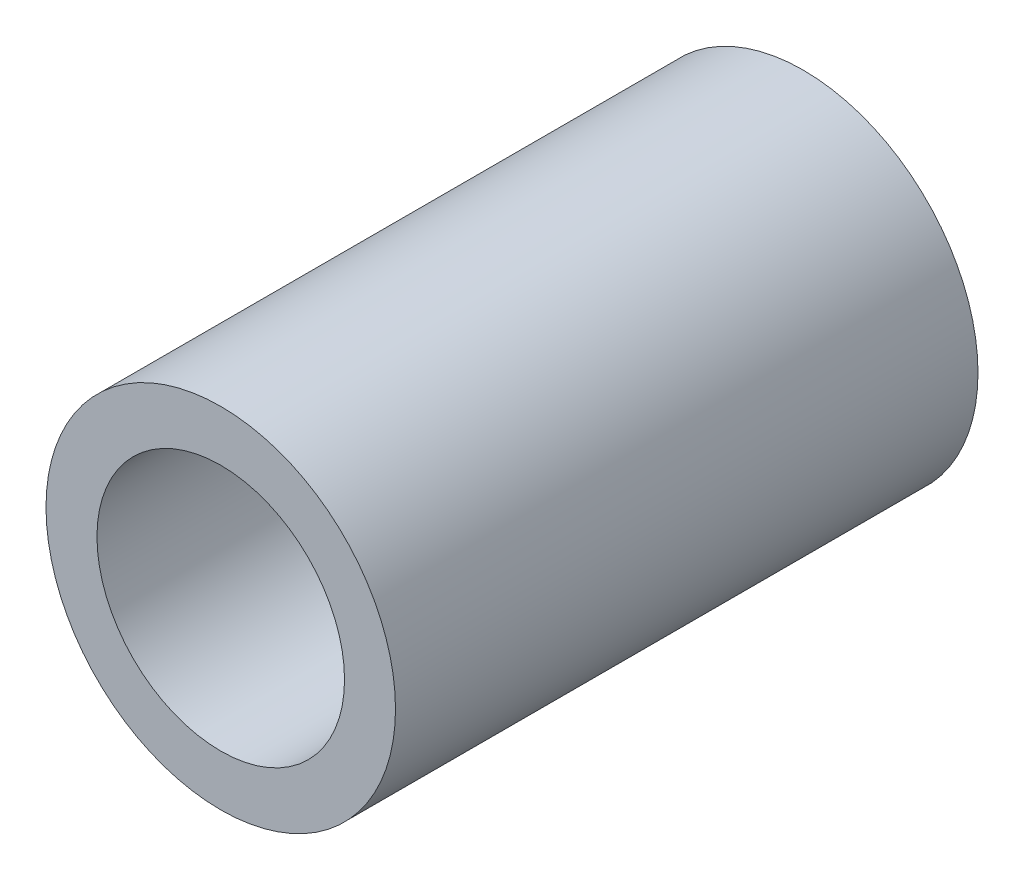
ISO-10303-21;
HEADER;
FILE_DESCRIPTION(('STEP AP214'),'2;1');
FILE_NAME('part.step','',(''),(''),'','','');
FILE_SCHEMA(('AUTOMOTIVE_DESIGN { 1 0 10303 214 1 1 1 1 }'));
ENDSEC;
DATA;
#1=APPLICATION_CONTEXT('core data for automotive mechanical design processes');
#2=APPLICATION_PROTOCOL_DEFINITION('international standard','automotive_design',2000,#1);
#3=PRODUCT_CONTEXT('',#1,'mechanical');
#4=PRODUCT('Part','Part','',(#3));
#5=PRODUCT_RELATED_PRODUCT_CATEGORY('part','',(#4));
#6=PRODUCT_DEFINITION_FORMATION('','',#4);
#7=PRODUCT_DEFINITION_CONTEXT('part definition',#1,'design');
#8=PRODUCT_DEFINITION('design','',#6,#7);
#9=PRODUCT_DEFINITION_SHAPE('','',#8);
#10=(LENGTH_UNIT() NAMED_UNIT(*) SI_UNIT(.MILLI.,.METRE.));
#11=(NAMED_UNIT(*) PLANE_ANGLE_UNIT() SI_UNIT($,.RADIAN.));
#12=(NAMED_UNIT(*) SI_UNIT($,.STERADIAN.) SOLID_ANGLE_UNIT());
#13=UNCERTAINTY_MEASURE_WITH_UNIT(LENGTH_MEASURE(1.E-05),#10,'distance_accuracy_value','');
#14=(GEOMETRIC_REPRESENTATION_CONTEXT(3) GLOBAL_UNCERTAINTY_ASSIGNED_CONTEXT((#13)) GLOBAL_UNIT_ASSIGNED_CONTEXT((#10,
#11,#12)) REPRESENTATION_CONTEXT('',''));
#15=CARTESIAN_POINT('',(0.,0.,0.));
#16=DIRECTION('',(0.,0.,1.));
#17=DIRECTION('',(1.,0.,0.));
#18=AXIS2_PLACEMENT_3D('',#15,#16,#17);
#19=CARTESIAN_POINT('',(33.,0.,20.));
#20=DIRECTION('',(0.,0.,1.));
#21=DIRECTION('',(1.,0.,0.));
#22=AXIS2_PLACEMENT_3D('',#19,#20,#21);
#23=PLANE('',#22);
#24=CARTESIAN_POINT('',(33.,0.,20.));
#25=DIRECTION('',(0.,0.,1.));
#26=DIRECTION('',(1.,0.,0.));
#27=AXIS2_PLACEMENT_3D('',#24,#25,#26);
#28=CIRCLE('',#27,6.);
#29=CARTESIAN_POINT('',(39.,0.,20.));
#30=VERTEX_POINT('',#29);
#31=EDGE_CURVE('E10',#30,#30,#28,.T.);
#32=ORIENTED_EDGE('',*,*,#31,.T.);
#33=EDGE_LOOP('',(#32));
#34=FACE_BOUND('',#33,.T.);
#35=CARTESIAN_POINT('',(33.,0.,20.));
#36=DIRECTION('',(0.,0.,1.));
#37=DIRECTION('',(1.,0.,0.));
#38=AXIS2_PLACEMENT_3D('',#35,#36,#37);
#39=CIRCLE('',#38,4.25000000000001);
#40=CARTESIAN_POINT('',(37.25,0.,20.));
#41=VERTEX_POINT('',#40);
#42=EDGE_CURVE('E39',#41,#41,#39,.T.);
#43=ORIENTED_EDGE('',*,*,#42,.F.);
#44=EDGE_LOOP('',(#43));
#45=FACE_BOUND('',#44,.T.);
#46=ADVANCED_FACE('F28',(#34,#45),#23,.T.);
#47=CARTESIAN_POINT('',(33.,0.,0.));
#48=DIRECTION('',(0.,0.,1.));
#49=DIRECTION('',(1.,0.,0.));
#50=AXIS2_PLACEMENT_3D('',#47,#48,#49);
#51=PLANE('',#50);
#52=CARTESIAN_POINT('',(33.,0.,0.));
#53=DIRECTION('',(0.,0.,1.));
#54=DIRECTION('',(1.,0.,0.));
#55=AXIS2_PLACEMENT_3D('',#52,#53,#54);
#56=CIRCLE('',#55,6.);
#57=CARTESIAN_POINT('',(39.,0.,0.));
#58=VERTEX_POINT('',#57);
#59=EDGE_CURVE('E32',#58,#58,#56,.T.);
#60=ORIENTED_EDGE('',*,*,#59,.F.);
#61=EDGE_LOOP('',(#60));
#62=FACE_BOUND('',#61,.T.);
#63=CARTESIAN_POINT('',(33.,0.,0.));
#64=DIRECTION('',(0.,0.,1.));
#65=DIRECTION('',(1.,0.,0.));
#66=AXIS2_PLACEMENT_3D('',#63,#64,#65);
#67=CIRCLE('',#66,4.25000000000001);
#68=CARTESIAN_POINT('',(37.25,0.,0.));
#69=VERTEX_POINT('',#68);
#70=EDGE_CURVE('E41',#69,#69,#67,.T.);
#71=ORIENTED_EDGE('',*,*,#70,.T.);
#72=EDGE_LOOP('',(#71));
#73=FACE_BOUND('',#72,.T.);
#74=ADVANCED_FACE('F51',(#62,#73),#51,.F.);
#75=CARTESIAN_POINT('',(33.,0.,20.));
#76=DIRECTION('',(0.,0.,-1.));
#77=DIRECTION('',(-1.,0.,0.));
#78=AXIS2_PLACEMENT_3D('',#75,#76,#77);
#79=CYLINDRICAL_SURFACE('',#78,6.);
#80=ORIENTED_EDGE('',*,*,#31,.F.);
#81=EDGE_LOOP('',(#80));
#82=FACE_BOUND('',#81,.T.);
#83=ORIENTED_EDGE('',*,*,#59,.T.);
#84=EDGE_LOOP('',(#83));
#85=FACE_BOUND('',#84,.T.);
#86=ADVANCED_FACE('F30',(#82,#85),#79,.T.);
#87=CARTESIAN_POINT('',(33.,0.,20.));
#88=DIRECTION('',(0.,0.,-1.));
#89=DIRECTION('',(-1.,0.,0.));
#90=AXIS2_PLACEMENT_3D('',#87,#88,#89);
#91=CYLINDRICAL_SURFACE('',#90,4.25000000000001);
#92=ORIENTED_EDGE('',*,*,#42,.T.);
#93=EDGE_LOOP('',(#92));
#94=FACE_BOUND('',#93,.T.);
#95=ORIENTED_EDGE('',*,*,#70,.F.);
#96=EDGE_LOOP('',(#95));
#97=FACE_BOUND('',#96,.T.);
#98=ADVANCED_FACE('F47',(#94,#97),#91,.F.);
#99=CLOSED_SHELL('',(#46,#74,#86,#98));
#100=MANIFOLD_SOLID_BREP('B2',#99);
#101=ADVANCED_BREP_SHAPE_REPRESENTATION('',(#18,#100),#14);
#102=SHAPE_DEFINITION_REPRESENTATION(#9,#101);
ENDSEC;
END-ISO-10303-21;
